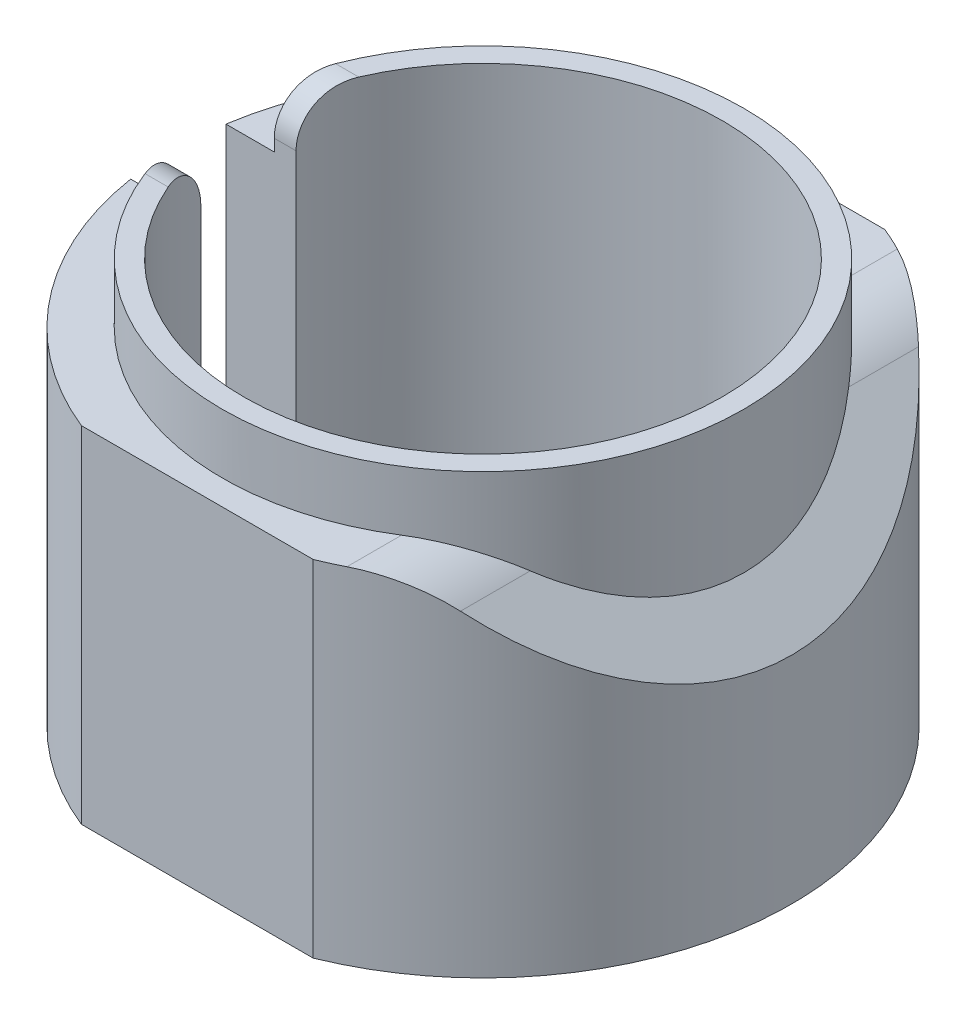
ISO-10303-21;
HEADER;
FILE_DESCRIPTION(('STEP AP214'),'2;1');
FILE_NAME('part.step','',(''),(''),'','','');
FILE_SCHEMA(('AUTOMOTIVE_DESIGN { 1 0 10303 214 1 1 1 1 }'));
ENDSEC;
DATA;
#1=APPLICATION_CONTEXT('core data for automotive mechanical design processes');
#2=APPLICATION_PROTOCOL_DEFINITION('international standard','automotive_design',2000,#1);
#3=PRODUCT_CONTEXT('',#1,'mechanical');
#4=PRODUCT('Part','Part','',(#3));
#5=PRODUCT_RELATED_PRODUCT_CATEGORY('part','',(#4));
#6=PRODUCT_DEFINITION_FORMATION('','',#4);
#7=PRODUCT_DEFINITION_CONTEXT('part definition',#1,'design');
#8=PRODUCT_DEFINITION('design','',#6,#7);
#9=PRODUCT_DEFINITION_SHAPE('','',#8);
#10=(LENGTH_UNIT() NAMED_UNIT(*) SI_UNIT(.MILLI.,.METRE.));
#11=(NAMED_UNIT(*) PLANE_ANGLE_UNIT() SI_UNIT($,.RADIAN.));
#12=(NAMED_UNIT(*) SI_UNIT($,.STERADIAN.) SOLID_ANGLE_UNIT());
#13=UNCERTAINTY_MEASURE_WITH_UNIT(LENGTH_MEASURE(1.E-05),#10,'distance_accuracy_value','');
#14=(GEOMETRIC_REPRESENTATION_CONTEXT(3) GLOBAL_UNCERTAINTY_ASSIGNED_CONTEXT((#13)) GLOBAL_UNIT_ASSIGNED_CONTEXT((#10,
#11,#12)) REPRESENTATION_CONTEXT('',''));
#15=CARTESIAN_POINT('',(0.,0.,0.));
#16=DIRECTION('',(0.,0.,1.));
#17=DIRECTION('',(1.,0.,0.));
#18=AXIS2_PLACEMENT_3D('',#15,#16,#17);
#19=CARTESIAN_POINT('',(0.,12.5,0.));
#20=DIRECTION('',(0.,1.,0.));
#21=DIRECTION('',(0.,0.,1.));
#22=AXIS2_PLACEMENT_3D('',#19,#20,#21);
#23=PLANE('',#22);
#24=CARTESIAN_POINT('',(0.,12.5,0.));
#25=DIRECTION('',(0.,1.,0.));
#26=DIRECTION('',(0.,0.,1.));
#27=AXIS2_PLACEMENT_3D('',#24,#25,#26);
#28=CIRCLE('',#27,10.95);
#29=CARTESIAN_POINT('',(-10.7658023388877,12.5,-2.));
#30=VERTEX_POINT('',#29);
#31=CARTESIAN_POINT('',(5.84314575050762,12.5,-9.26067749888337));
#32=VERTEX_POINT('',#31);
#33=EDGE_CURVE('E237',#30,#32,#28,.F.);
#34=ORIENTED_EDGE('',*,*,#33,.T.);
#35=DIRECTION('',(0.,0.,1.));
#36=VECTOR('',#35,1.);
#37=CARTESIAN_POINT('',(5.84314575050762,12.5,-10.5571066111885));
#38=LINE('',#37,#36);
#39=CARTESIAN_POINT('',(5.84314575050762,12.5,-11.5568225623795));
#40=VERTEX_POINT('',#39);
#41=EDGE_CURVE('E365',#32,#40,#38,.F.);
#42=ORIENTED_EDGE('',*,*,#41,.T.);
#43=CARTESIAN_POINT('',(0.,12.5,0.));
#44=DIRECTION('',(0.,1.,0.));
#45=DIRECTION('',(0.,0.,1.));
#46=AXIS2_PLACEMENT_3D('',#43,#44,#45);
#47=CIRCLE('',#46,12.95);
#48=CARTESIAN_POINT('',(4.86852133609374,12.5,-12.));
#49=VERTEX_POINT('',#48);
#50=EDGE_CURVE('E439',#40,#49,#47,.T.);
#51=ORIENTED_EDGE('',*,*,#50,.T.);
#52=DIRECTION('',(1.,0.,0.));
#53=VECTOR('',#52,1.);
#54=CARTESIAN_POINT('',(0.,12.5,-12.));
#55=LINE('',#54,#53);
#56=CARTESIAN_POINT('',(-4.86852133609374,12.5,-12.));
#57=VERTEX_POINT('',#56);
#58=EDGE_CURVE('E415',#57,#49,#55,.T.);
#59=ORIENTED_EDGE('',*,*,#58,.F.);
#60=CARTESIAN_POINT('',(-12.7946277788766,12.5,-2.));
#61=VERTEX_POINT('',#60);
#62=EDGE_CURVE('E241',#57,#61,#47,.T.);
#63=ORIENTED_EDGE('',*,*,#62,.T.);
#64=DIRECTION('',(1.,0.,0.));
#65=VECTOR('',#64,1.);
#66=CARTESIAN_POINT('',(0.,12.5,-2.));
#67=LINE('',#66,#65);
#68=EDGE_CURVE('E230',#61,#30,#67,.T.);
#69=ORIENTED_EDGE('',*,*,#68,.T.);
#70=EDGE_LOOP('',(#34,#42,#51,#59,#63,#69));
#71=FACE_BOUND('',#70,.T.);
#72=ADVANCED_FACE('F103',(#71),#23,.T.);
#73=CARTESIAN_POINT('',(10.,10.,-12.));
#74=DIRECTION('',(-0.707106781186547,-0.707106781186547,0.));
#75=DIRECTION('',(0.707106781186548,-0.707106781186548,0.));
#76=AXIS2_PLACEMENT_3D('',#73,#74,#75);
#77=PLANE('',#76);
#78=CARTESIAN_POINT('',(0.,20.,0.));
#79=DIRECTION('',(-0.707106781186547,-0.707106781186547,0.));
#80=DIRECTION('',(0.707106781186548,-0.707106781186548,0.));
#81=AXIS2_PLACEMENT_3D('',#78,#79,#80);
#82=ELLIPSE('',#81,15.4856385079854,10.95);
#83=CARTESIAN_POINT('',(8.67157287525381,11.3284271247462,6.68627877590834));
#84=VERTEX_POINT('',#83);
#85=CARTESIAN_POINT('',(8.67157287525381,11.3284271247462,-6.68627877590834));
#86=VERTEX_POINT('',#85);
#87=EDGE_CURVE('E258',#84,#86,#82,.F.);
#88=ORIENTED_EDGE('',*,*,#87,.F.);
#89=DIRECTION('',(0.,0.,1.));
#90=VECTOR('',#89,1.);
#91=CARTESIAN_POINT('',(8.67157287525381,11.3284271247462,10.5571066111885));
#92=LINE('',#91,#90);
#93=CARTESIAN_POINT('',(8.67157287525381,11.3284271247462,9.61802078751977));
#94=VERTEX_POINT('',#93);
#95=EDGE_CURVE('E373',#84,#94,#92,.T.);
#96=ORIENTED_EDGE('',*,*,#95,.T.);
#97=CARTESIAN_POINT('',(0.,20.,0.));
#98=DIRECTION('',(-0.707106781186547,-0.707106781186547,0.));
#99=DIRECTION('',(-0.707106781186548,0.707106781186548,0.));
#100=AXIS2_PLACEMENT_3D('',#97,#98,#99);
#101=ELLIPSE('',#100,18.3140656327316,12.95);
#102=CARTESIAN_POINT('',(8.67157287525381,11.3284271247462,-9.61802078751977));
#103=VERTEX_POINT('',#102);
#104=EDGE_CURVE('E413',#94,#103,#101,.F.);
#105=ORIENTED_EDGE('',*,*,#104,.T.);
#106=DIRECTION('',(0.,0.,1.));
#107=VECTOR('',#106,1.);
#108=CARTESIAN_POINT('',(8.67157287525381,11.3284271247462,-7.97825168818332));
#109=LINE('',#108,#107);
#110=EDGE_CURVE('E378',#103,#86,#109,.T.);
#111=ORIENTED_EDGE('',*,*,#110,.T.);
#112=EDGE_LOOP('',(#88,#96,#105,#111));
#113=FACE_BOUND('',#112,.T.);
#114=ADVANCED_FACE('F465',(#113),#77,.F.);
#115=CARTESIAN_POINT('',(0.,-38.6281312654632,0.));
#116=DIRECTION('',(0.,1.,0.));
#117=DIRECTION('',(0.,0.,1.));
#118=AXIS2_PLACEMENT_3D('',#115,#116,#117);
#119=CYLINDRICAL_SURFACE('',#118,12.95);
#120=ORIENTED_EDGE('',*,*,#104,.F.);
#121=CARTESIAN_POINT('',(8.67157287525381,11.3284271247462,9.61802078751977));
#122=CARTESIAN_POINT('',(8.56843339638165,11.4315009301273,9.71104621796136));
#123=CARTESIAN_POINT('',(8.46036247208684,11.5283598370203,9.80544111251875));
#124=CARTESIAN_POINT('',(8.23497626491933,11.709383813392,9.99545948181946));
#125=CARTESIAN_POINT('',(8.11765825378154,11.7935451150587,10.0910833121313));
#126=CARTESIAN_POINT('',(7.87819876781828,11.9464598240635,10.2790560358235));
#127=CARTESIAN_POINT('',(7.75631667483663,12.0156075538522,10.3714151873124));
#128=CARTESIAN_POINT('',(7.50508383645346,12.1411092613291,10.5546368639504));
#129=CARTESIAN_POINT('',(7.37573465969701,12.1974659139188,10.6454996983201));
#130=CARTESIAN_POINT('',(7.13547625121042,12.2872222381665,10.8076044530726));
#131=CARTESIAN_POINT('',(7.02573331149218,12.3229492799191,10.879294016151));
#132=CARTESIAN_POINT('',(6.80225289194555,12.3850429232303,11.0204045561486));
#133=CARTESIAN_POINT('',(6.68851677182059,12.4114126776781,11.0898262900289));
#134=CARTESIAN_POINT('',(6.45461146814002,12.454821196604,11.227615088737));
#135=CARTESIAN_POINT('',(6.33435223977707,12.4716055644857,11.2959104150233));
#136=CARTESIAN_POINT('',(6.09080459229661,12.4942012407027,11.4290863500517));
#137=CARTESIAN_POINT('',(5.96751338233876,12.5000020244108,11.4939636257717));
#138=CARTESIAN_POINT('',(5.84314575050762,12.5,11.5568225623795));
#139=B_SPLINE_CURVE_WITH_KNOTS('',3,(#121,#122,#123,#124,#125,#126,#127,#128,#129,#130,#131,
#132,#133,#134,#135,#136,#137,#138),.UNSPECIFIED.,.F.,.F.,(4,2,2,2,2,2,2,2,4),(0.,
0.518663181519247,1.03747996664538,1.54033758438005,2.04308994619965,2.45031319997644,
2.85739911141748,3.27483937652447,3.69267943682645),.UNSPECIFIED.);
#140=CARTESIAN_POINT('',(5.84314575050762,12.5,11.5568225623795));
#141=VERTEX_POINT('',#140);
#142=EDGE_CURVE('E354',#94,#141,#139,.T.);
#143=ORIENTED_EDGE('',*,*,#142,.T.);
#144=CARTESIAN_POINT('',(4.86852133609374,12.5,12.));
#145=VERTEX_POINT('',#144);
#146=EDGE_CURVE('E437',#145,#141,#47,.T.);
#147=ORIENTED_EDGE('',*,*,#146,.F.);
#148=DIRECTION('',(0.,1.,0.));
#149=VECTOR('',#148,1.);
#150=CARTESIAN_POINT('',(4.86852133609374,-38.6281312654632,12.));
#151=LINE('',#150,#149);
#152=CARTESIAN_POINT('',(4.86852133609374,-2.,12.));
#153=VERTEX_POINT('',#152);
#154=EDGE_CURVE('E428',#145,#153,#151,.F.);
#155=ORIENTED_EDGE('',*,*,#154,.T.);
#156=CARTESIAN_POINT('',(0.,-2.,0.));
#157=DIRECTION('',(0.,1.,0.));
#158=DIRECTION('',(0.,0.,1.));
#159=AXIS2_PLACEMENT_3D('',#156,#157,#158);
#160=CIRCLE('',#159,12.95);
#161=CARTESIAN_POINT('',(4.86852133609374,-2.,-12.));
#162=VERTEX_POINT('',#161);
#163=EDGE_CURVE('E436',#162,#153,#160,.F.);
#164=ORIENTED_EDGE('',*,*,#163,.F.);
#165=DIRECTION('',(0.,1.,0.));
#166=VECTOR('',#165,1.);
#167=CARTESIAN_POINT('',(4.86852133609374,-38.6281312654632,-12.));
#168=LINE('',#167,#166);
#169=EDGE_CURVE('E420',#49,#162,#168,.F.);
#170=ORIENTED_EDGE('',*,*,#169,.F.);
#171=ORIENTED_EDGE('',*,*,#50,.F.);
#172=CARTESIAN_POINT('',(5.84314575050762,12.5,-11.5568225623795));
#173=CARTESIAN_POINT('',(5.99863575084707,12.5000010670294,-11.47825704177));
#174=CARTESIAN_POINT('',(6.15239574329887,12.4909379210163,-11.3965283253239));
#175=CARTESIAN_POINT('',(6.45486830548763,12.4558733660924,-11.2279472274124));
#176=CARTESIAN_POINT('',(6.60358690150429,12.4298929887283,-11.1411013294063));
#177=CARTESIAN_POINT('',(6.89039388825273,12.3631987474695,-10.9659677345504));
#178=CARTESIAN_POINT('',(7.02866757302276,12.3229525376403,-10.877802380175));
#179=CARTESIAN_POINT('',(7.29850174753831,12.2285879906429,-10.6986250176063));
#180=CARTESIAN_POINT('',(7.43006115452062,12.1744674244799,-10.6076125540733));
#181=CARTESIAN_POINT('',(7.66001955707812,12.0653547465125,-10.4423388602464));
#182=CARTESIAN_POINT('',(7.7597711160899,12.0127215258195,-10.3683851600376));
#183=CARTESIAN_POINT('',(7.95418482487935,11.899435819257,-10.2199996403586));
#184=CARTESIAN_POINT('',(8.04884850996478,11.8387857718592,-10.1455679727951));
#185=CARTESIAN_POINT('',(8.23512712945479,11.7080691333295,-9.99499172872379));
#186=CARTESIAN_POINT('',(8.32660653623354,11.6378049167526,-9.91885088648539));
#187=CARTESIAN_POINT('',(8.50363378111221,11.4891674644433,-9.76751523179292));
#188=CARTESIAN_POINT('',(8.58917963222626,11.4107915340068,-9.69232074308097));
#189=CARTESIAN_POINT('',(8.67157287525381,11.3284271247462,-9.61802078751977));
#190=B_SPLINE_CURVE_WITH_KNOTS('',3,(#172,#173,#174,#175,#176,#177,#178,#179,#180,#181,#182,
#183,#184,#185,#186,#187,#188,#189),.UNSPECIFIED.,.F.,.F.,(4,2,2,2,2,2,2,2,4),(0.,
0.522196554669505,1.04374514948574,1.54957472730347,2.05548562052175,2.4597713700069,
2.8639344299895,3.27820904646954,3.69262172904286),.UNSPECIFIED.);
#191=EDGE_CURVE('E369',#40,#103,#190,.T.);
#192=ORIENTED_EDGE('',*,*,#191,.T.);
#193=EDGE_LOOP('',(#120,#143,#147,#155,#164,#170,#171,#192));
#194=FACE_BOUND('',#193,.T.);
#195=ADVANCED_FACE('F314',(#194),#119,.T.);
#196=DIRECTION('',(0.,1.,0.));
#197=VECTOR('',#196,1.);
#198=CARTESIAN_POINT('',(-12.7946277788766,-38.6281312654632,2.));
#199=LINE('',#198,#197);
#200=CARTESIAN_POINT('',(-12.7946277788766,1.99999999999999,2.));
#201=VERTEX_POINT('',#200);
#202=CARTESIAN_POINT('',(-12.7946277788766,12.5,2.));
#203=VERTEX_POINT('',#202);
#204=EDGE_CURVE('E411',#201,#203,#199,.T.);
#205=ORIENTED_EDGE('',*,*,#204,.F.);
#206=CARTESIAN_POINT('',(-12.7946277788766,2.,2.));
#207=CARTESIAN_POINT('',(-12.7946256332506,1.94408781043635,2.00000002573826));
#208=CARTESIAN_POINT('',(-12.7949947479576,1.88820273819576,1.99765388963396));
#209=CARTESIAN_POINT('',(-12.7964529824156,1.77683916091667,1.98829682131698));
#210=CARTESIAN_POINT('',(-12.7975420354279,1.72136061867447,1.98128632149406));
#211=CARTESIAN_POINT('',(-12.8018492907163,1.55628329415424,1.95333880678219));
#212=CARTESIAN_POINT('',(-12.8061077787187,1.44780072599633,1.92548550077359));
#213=CARTESIAN_POINT('',(-12.8169175381375,1.23712269491746,1.85215577418208));
#214=CARTESIAN_POINT('',(-12.8234694310701,1.13492894511174,1.80667457605526));
#215=CARTESIAN_POINT('',(-12.8381248342533,0.939604815726317,1.69940297039855));
#216=CARTESIAN_POINT('',(-12.8462283567749,0.846474507833138,1.63761243388568));
#217=CARTESIAN_POINT('',(-12.8631491660451,0.67116909493783,1.49893143639688));
#218=CARTESIAN_POINT('',(-12.8719713191882,0.589080746372092,1.42193194358738));
#219=CARTESIAN_POINT('',(-12.8892934354307,0.438922995521076,1.25523787570596));
#220=CARTESIAN_POINT('',(-12.8977933369221,0.37085626297225,1.16554088848749));
#221=CARTESIAN_POINT('',(-12.9135655225394,0.250350104548857,0.975429449628955));
#222=CARTESIAN_POINT('',(-12.9208310146627,0.197995996840185,0.874960367828575));
#223=CARTESIAN_POINT('',(-12.9332549284202,0.110966222855453,0.66654543071696));
#224=CARTESIAN_POINT('',(-12.9384147257827,0.0762790104560919,0.558604511132324));
#225=CARTESIAN_POINT('',(-12.9447779408629,0.0340254317766948,0.3750257805887));
#226=CARTESIAN_POINT('',(-12.9467261965863,0.0212778955814985,0.300564992169304));
#227=CARTESIAN_POINT('',(-12.9493413997215,0.00426401957549366,0.150747445660465));
#228=CARTESIAN_POINT('',(-12.9500098440486,-1.22287739627625E-05,0.0753918381634179));
#229=CARTESIAN_POINT('',(-12.95,0.,0.));
#230=B_SPLINE_CURVE_WITH_KNOTS('',3,(#206,#207,#208,#209,#210,#211,#212,#213,#214,#215,#216,
#217,#218,#219,#220,#221,#222,#223,#224,#225,#226,#227,#228,#229),.UNSPECIFIED.,.F.,.F.,(4,2,2,
2,2,2,2,2,2,2,2,4),(0.,0.167632475682958,0.335249413883563,0.669766357677263,1.00437402633827,
1.33898434133517,1.67608672267633,2.01325322960552,2.35221870858211,2.69096237295107,
2.91720895132186,3.14319074117967),.UNSPECIFIED.);
#231=CARTESIAN_POINT('',(-12.95,0.,0.));
#232=VERTEX_POINT('',#231);
#233=EDGE_CURVE('E330',#201,#232,#230,.T.);
#234=ORIENTED_EDGE('',*,*,#233,.T.);
#235=CARTESIAN_POINT('',(-12.95,0.,0.));
#236=CARTESIAN_POINT('',(-12.950002014148,-1.48172826040973E-08,-0.0559162229000142));
#237=CARTESIAN_POINT('',(-12.9496373883563,0.00234644960810248,-0.111805341523206));
#238=CARTESIAN_POINT('',(-12.9481962405879,0.0117048966110776,-0.223177238487953));
#239=CARTESIAN_POINT('',(-12.9471197832777,0.0187164553872646,-0.278660053277413));
#240=CARTESIAN_POINT('',(-12.942860681548,0.0466685575209165,-0.443751704701726));
#241=CARTESIAN_POINT('',(-12.9386481279771,0.0745268002895366,-0.55224462048176));
#242=CARTESIAN_POINT('',(-12.9279380237389,0.147870899920631,-0.762943912039565));
#243=CARTESIAN_POINT('',(-12.9214398346178,0.193361682499116,-0.865148521902832));
#244=CARTESIAN_POINT('',(-12.9068762993701,0.30065568075933,-1.06049052813423));
#245=CARTESIAN_POINT('',(-12.8988109492736,0.362458937763856,-1.15362790153239));
#246=CARTESIAN_POINT('',(-12.8819363508063,0.501152788024086,-1.32892507689081));
#247=CARTESIAN_POINT('',(-12.8731221313219,0.578149556362757,-1.41100036080273));
#248=CARTESIAN_POINT('',(-12.8557803600952,0.744832811767628,-1.56113298045433));
#249=CARTESIAN_POINT('',(-12.8472528645212,0.83452176747307,-1.62918758282288));
#250=CARTESIAN_POINT('',(-12.8314006752412,1.02462611917452,-1.7496809627547));
#251=CARTESIAN_POINT('',(-12.824082821451,1.12509754611792,-1.80203221684575));
#252=CARTESIAN_POINT('',(-12.8115538637689,1.33351726637838,-1.88905593253119));
#253=CARTESIAN_POINT('',(-12.8063413737306,1.44146058526554,-1.92374002991201));
#254=CARTESIAN_POINT('',(-12.7999100470753,1.62503072282316,-1.96598485794204));
#255=CARTESIAN_POINT('',(-12.7979397392583,1.69947979903887,-1.97872844716275));
#256=CARTESIAN_POINT('',(-12.7952941861159,1.84927457081914,-1.99573722333451));
#257=CARTESIAN_POINT('',(-12.7946174381016,1.92461912358411,-2.0000122481689));
#258=CARTESIAN_POINT('',(-12.7946277788766,2.,-2.));
#259=B_SPLINE_CURVE_WITH_KNOTS('',3,(#235,#236,#237,#238,#239,#240,#241,#242,#243,#244,#245,
#246,#247,#248,#249,#250,#251,#252,#253,#254,#255,#256,#257,#258),.UNSPECIFIED.,.F.,.F.,(4,2,2,
2,2,2,2,2,2,2,2,4),(0.,0.167644611880985,0.335273996133688,0.669819430009937,1.00445838783946,
1.33909819338527,1.67616509087818,2.01329763845469,2.35227571580647,2.69103024881158,
2.91724192675227,3.14319066139638),.UNSPECIFIED.);
#260=CARTESIAN_POINT('',(-12.7946277788766,1.99999999999999,-2.));
#261=VERTEX_POINT('',#260);
#262=EDGE_CURVE('E331',#232,#261,#259,.T.);
#263=ORIENTED_EDGE('',*,*,#262,.T.);
#264=DIRECTION('',(0.,1.,0.));
#265=VECTOR('',#264,1.);
#266=CARTESIAN_POINT('',(-12.7946277788766,-38.6281312654632,-2.));
#267=LINE('',#266,#265);
#268=EDGE_CURVE('E242',#261,#61,#267,.T.);
#269=ORIENTED_EDGE('',*,*,#268,.T.);
#270=ORIENTED_EDGE('',*,*,#62,.F.);
#271=DIRECTION('',(0.,1.,0.));
#272=VECTOR('',#271,1.);
#273=CARTESIAN_POINT('',(-4.86852133609374,-38.6281312654632,-12.));
#274=LINE('',#273,#272);
#275=CARTESIAN_POINT('',(-4.86852133609374,-2.,-12.));
#276=VERTEX_POINT('',#275);
#277=EDGE_CURVE('E418',#276,#57,#274,.T.);
#278=ORIENTED_EDGE('',*,*,#277,.F.);
#279=CARTESIAN_POINT('',(-4.86852133609374,-2.,12.));
#280=VERTEX_POINT('',#279);
#281=EDGE_CURVE('E432',#280,#276,#160,.F.);
#282=ORIENTED_EDGE('',*,*,#281,.F.);
#283=DIRECTION('',(0.,1.,0.));
#284=VECTOR('',#283,1.);
#285=CARTESIAN_POINT('',(-4.86852133609374,-38.6281312654632,12.));
#286=LINE('',#285,#284);
#287=CARTESIAN_POINT('',(-4.86852133609374,12.5,12.));
#288=VERTEX_POINT('',#287);
#289=EDGE_CURVE('E425',#280,#288,#286,.T.);
#290=ORIENTED_EDGE('',*,*,#289,.T.);
#291=EDGE_CURVE('E431',#203,#288,#47,.T.);
#292=ORIENTED_EDGE('',*,*,#291,.F.);
#293=EDGE_LOOP('',(#205,#234,#263,#269,#270,#278,#282,#290,#292));
#294=FACE_BOUND('',#293,.T.);
#295=ADVANCED_FACE('F468',(#294),#119,.T.);
#296=ORIENTED_EDGE('',*,*,#146,.T.);
#297=DIRECTION('',(0.,0.,1.));
#298=VECTOR('',#297,1.);
#299=CARTESIAN_POINT('',(5.84314575050762,12.5,7.97825168818332));
#300=LINE('',#299,#298);
#301=CARTESIAN_POINT('',(5.84314575050762,12.5,9.26067749888337));
#302=VERTEX_POINT('',#301);
#303=EDGE_CURVE('E126',#141,#302,#300,.F.);
#304=ORIENTED_EDGE('',*,*,#303,.T.);
#305=CARTESIAN_POINT('',(-10.7658023388877,12.5,2.));
#306=VERTEX_POINT('',#305);
#307=EDGE_CURVE('E246',#302,#306,#28,.F.);
#308=ORIENTED_EDGE('',*,*,#307,.T.);
#309=DIRECTION('',(1.,0.,0.));
#310=VECTOR('',#309,1.);
#311=CARTESIAN_POINT('',(0.,12.5,2.));
#312=LINE('',#311,#310);
#313=EDGE_CURVE('E408',#203,#306,#312,.T.);
#314=ORIENTED_EDGE('',*,*,#313,.F.);
#315=ORIENTED_EDGE('',*,*,#291,.T.);
#316=DIRECTION('',(1.,0.,0.));
#317=VECTOR('',#316,1.);
#318=CARTESIAN_POINT('',(0.,12.5,12.));
#319=LINE('',#318,#317);
#320=EDGE_CURVE('E422',#288,#145,#319,.T.);
#321=ORIENTED_EDGE('',*,*,#320,.T.);
#322=EDGE_LOOP('',(#296,#304,#308,#314,#315,#321));
#323=FACE_BOUND('',#322,.T.);
#324=ADVANCED_FACE('F473',(#323),#23,.T.);
#325=CARTESIAN_POINT('',(0.,-2.,0.));
#326=DIRECTION('',(0.,1.,0.));
#327=DIRECTION('',(0.,0.,1.));
#328=AXIS2_PLACEMENT_3D('',#325,#326,#327);
#329=PLANE('',#328);
#330=CARTESIAN_POINT('',(0.,-2.,0.));
#331=DIRECTION('',(0.,1.,0.));
#332=DIRECTION('',(0.,0.,1.));
#333=AXIS2_PLACEMENT_3D('',#330,#331,#332);
#334=CIRCLE('',#333,1.6);
#335=CARTESIAN_POINT('',(0.,-2.,1.6));
#336=VERTEX_POINT('',#335);
#337=EDGE_CURVE('E393',#336,#336,#334,.T.);
#338=ORIENTED_EDGE('',*,*,#337,.T.);
#339=EDGE_LOOP('',(#338));
#340=FACE_BOUND('',#339,.T.);
#341=DIRECTION('',(1.,0.,0.));
#342=VECTOR('',#341,1.);
#343=CARTESIAN_POINT('',(0.,-2.,12.));
#344=LINE('',#343,#342);
#345=EDGE_CURVE('E256',#280,#153,#344,.T.);
#346=ORIENTED_EDGE('',*,*,#345,.F.);
#347=ORIENTED_EDGE('',*,*,#281,.T.);
#348=DIRECTION('',(1.,0.,0.));
#349=VECTOR('',#348,1.);
#350=CARTESIAN_POINT('',(0.,-2.,-12.));
#351=LINE('',#350,#349);
#352=EDGE_CURVE('E249',#276,#162,#351,.T.);
#353=ORIENTED_EDGE('',*,*,#352,.T.);
#354=ORIENTED_EDGE('',*,*,#163,.T.);
#355=EDGE_LOOP('',(#346,#347,#353,#354));
#356=FACE_BOUND('',#355,.T.);
#357=ADVANCED_FACE('F481',(#340,#356),#329,.F.);
#358=CARTESIAN_POINT('',(0.,-2.,0.));
#359=DIRECTION('',(0.,1.,0.));
#360=DIRECTION('',(0.,0.,1.));
#361=AXIS2_PLACEMENT_3D('',#358,#359,#360);
#362=CYLINDRICAL_SURFACE('',#361,10.95);
#363=CARTESIAN_POINT('',(0.,15.,0.));
#364=DIRECTION('',(0.,1.,0.));
#365=DIRECTION('',(0.,0.,1.));
#366=AXIS2_PLACEMENT_3D('',#363,#364,#365);
#367=CIRCLE('',#366,10.95);
#368=CARTESIAN_POINT('',(-10.1932575754761,15.,4.));
#369=VERTEX_POINT('',#368);
#370=CARTESIAN_POINT('',(-10.1932575754761,15.,-4.));
#371=VERTEX_POINT('',#370);
#372=EDGE_CURVE('E250',#369,#371,#367,.T.);
#373=ORIENTED_EDGE('',*,*,#372,.F.);
#374=CARTESIAN_POINT('',(-10.1932575754761,15.,4.));
#375=CARTESIAN_POINT('',(-10.215252763081,14.9999980404342,3.94395580736491));
#376=CARTESIAN_POINT('',(-10.2367726894939,14.9976424240735,3.88774865686013));
#377=CARTESIAN_POINT('',(-10.278763936511,14.9881427232847,3.77532885443158));
#378=CARTESIAN_POINT('',(-10.2992349308407,14.9809971585409,3.7191162061801));
#379=CARTESIAN_POINT('',(-10.3589318186561,14.9522440665045,3.55093412099844));
#380=CARTESIAN_POINT('',(-10.396414218504,14.9233199415595,3.43949052860539));
#381=CARTESIAN_POINT('',(-10.4660062849451,14.8459210445999,3.22154624898223));
#382=CARTESIAN_POINT('',(-10.4981034747342,14.7974017349488,3.11505744249417));
#383=CARTESIAN_POINT('',(-10.5564731190204,14.6816816580941,2.91111916175955));
#384=CARTESIAN_POINT('',(-10.5827523464388,14.6145028208865,2.81365925433323));
#385=CARTESIAN_POINT('',(-10.6284541461997,14.4667138672042,2.6356283805551));
#386=CARTESIAN_POINT('',(-10.648139927659,14.386878914054,2.55448069235084));
#387=CARTESIAN_POINT('',(-10.6825646937403,14.2139256856405,2.40647086598696));
#388=CARTESIAN_POINT('',(-10.6973022679429,14.1208036338297,2.33961280286125));
#389=CARTESIAN_POINT('',(-10.721848488476,13.9270807844682,2.22437484910673));
#390=CARTESIAN_POINT('',(-10.7317936886813,13.8267944908461,2.17549381476017));
#391=CARTESIAN_POINT('',(-10.7477910021851,13.6192576023916,2.09503794195539));
#392=CARTESIAN_POINT('',(-10.7538463120501,13.5120128058043,2.06344889675159));
#393=CARTESIAN_POINT('',(-10.7606900674744,13.3366406188279,2.02737163758506));
#394=CARTESIAN_POINT('',(-10.7626129789312,13.269688414526,2.01711247846942));
#395=CARTESIAN_POINT('',(-10.7651655394167,13.1351674568692,2.00342879892052));
#396=CARTESIAN_POINT('',(-10.7657971441038,13.0675997917526,1.99999394343758));
#397=CARTESIAN_POINT('',(-10.7658023388877,13.,2.));
#398=B_SPLINE_CURVE_WITH_KNOTS('',3,(#374,#375,#376,#377,#378,#379,#380,#381,#382,#383,#384,
#385,#386,#387,#388,#389,#390,#391,#392,#393,#394,#395,#396,#397),.UNSPECIFIED.,.F.,.F.,(4,2,2,
2,2,2,2,2,2,2,2,4),(0.,0.180521425972547,0.36109866715912,0.722475887843784,1.08467914258227,
1.44645849863325,1.79131682507501,2.1362733654185,2.47071461982338,2.80488069013857,
3.00783442325068,3.21048055858087),.UNSPECIFIED.);
#399=CARTESIAN_POINT('',(-10.7658023388877,13.,2.));
#400=VERTEX_POINT('',#399);
#401=EDGE_CURVE('E272',#369,#400,#398,.T.);
#402=ORIENTED_EDGE('',*,*,#401,.T.);
#403=DIRECTION('',(0.,1.,0.));
#404=VECTOR('',#403,1.);
#405=CARTESIAN_POINT('',(-10.7658023388877,-2.,2.));
#406=LINE('',#405,#404);
#407=EDGE_CURVE('E405',#306,#400,#406,.T.);
#408=ORIENTED_EDGE('',*,*,#407,.F.);
#409=ORIENTED_EDGE('',*,*,#307,.F.);
#410=CARTESIAN_POINT('',(5.84314575050762,12.5,9.26067749888337));
#411=CARTESIAN_POINT('',(5.98938209950837,12.4999909726688,9.16845309178599));
#412=CARTESIAN_POINT('',(6.13328044290744,12.4919849200221,9.07277384412176));
#413=CARTESIAN_POINT('',(6.41516748853902,12.4614222940156,8.87566495463887));
#414=CARTESIAN_POINT('',(6.5531651961525,12.4388888036242,8.774244667679));
#415=CARTESIAN_POINT('',(6.8192394356403,12.3814074311287,8.56901936839899));
#416=CARTESIAN_POINT('',(6.94747497878486,12.3467720772026,8.46533087056427));
#417=CARTESIAN_POINT('',(7.1971144624535,12.266162392884,8.25413651125202));
#418=CARTESIAN_POINT('',(7.31851581736812,12.2201838058966,8.14662922975389));
#419=CARTESIAN_POINT('',(7.55268022035448,12.1185071762072,7.92998521218733));
#420=CARTESIAN_POINT('',(7.66552918262403,12.0629318899487,7.82088331713557));
#421=CARTESIAN_POINT('',(7.88398131612507,11.9424616735392,7.60061866077882));
#422=CARTESIAN_POINT('',(7.98958470726526,11.8775670264231,7.489455962151));
#423=CARTESIAN_POINT('',(8.19597544581695,11.7373095697184,7.26309145569034));
#424=CARTESIAN_POINT('',(8.29657828936818,11.6617269791222,7.14785786443215));
#425=CARTESIAN_POINT('',(8.48995579380428,11.5016751385003,6.91707275821386));
#426=CARTESIAN_POINT('',(8.58273297646401,11.4172087710876,6.80152135815578));
#427=CARTESIAN_POINT('',(8.67157287525381,11.3284271247462,6.68627877590834));
#428=B_SPLINE_CURVE_WITH_KNOTS('',3,(#410,#411,#412,#413,#414,#415,#416,#417,#418,#419,#420,
#421,#422,#423,#424,#425,#426,#427),.UNSPECIFIED.,.F.,.F.,(4,2,2,2,2,2,2,2,4),(0.,
0.518238494883705,1.03565557180049,1.54059317571899,2.04572054853116,2.54480963729818,
3.04388357161824,3.55534028042088,4.06663154048371),.UNSPECIFIED.);
#429=EDGE_CURVE('E113',#302,#84,#428,.T.);
#430=ORIENTED_EDGE('',*,*,#429,.T.);
#431=ORIENTED_EDGE('',*,*,#87,.T.);
#432=CARTESIAN_POINT('',(8.67157287525381,11.3284271247462,-6.68627877590834));
#433=CARTESIAN_POINT('',(8.5825110430061,11.4174301747021,-6.80180942463357));
#434=CARTESIAN_POINT('',(8.48949220478012,11.5020968790158,-6.91765023772995));
#435=CARTESIAN_POINT('',(8.29559154718877,11.6625051068781,-7.1490111779203));
#436=CARTESIAN_POINT('',(8.19470711412123,11.7382436424543,-7.26453118509245));
#437=CARTESIAN_POINT('',(7.98772927810993,11.8787565857703,-7.49144270113695));
#438=CARTESIAN_POINT('',(7.8818218065354,11.9437525419928,-7.60286635107109));
#439=CARTESIAN_POINT('',(7.66272768703201,12.0643745449507,-7.82363620290138));
#440=CARTESIAN_POINT('',(7.5495408652091,12.1200003677311,-7.93298235508796));
#441=CARTESIAN_POINT('',(7.31523589385804,12.2214730698144,-8.14956760186886));
#442=CARTESIAN_POINT('',(7.19406645220567,12.2672465661143,-8.25678582548219));
#443=CARTESIAN_POINT('',(6.94492709359735,12.3474926078862,-8.46741405088636));
#444=CARTESIAN_POINT('',(6.81695974938452,12.3819693938113,-8.57082546867164));
#445=CARTESIAN_POINT('',(6.55146987109813,12.4391828196101,-8.77550274344092));
#446=CARTESIAN_POINT('',(6.41378950899306,12.461608915353,-8.87665276907741));
#447=CARTESIAN_POINT('',(6.13256922186978,12.4920244922726,-9.07324648932016));
#448=CARTESIAN_POINT('',(5.98902038111741,12.4999911040569,-9.16868091393496));
#449=CARTESIAN_POINT('',(5.84314575050762,12.5,-9.26067749888337));
#450=B_SPLINE_CURVE_WITH_KNOTS('',3,(#432,#433,#434,#435,#436,#437,#438,#439,#440,#441,#442,
#443,#444,#445,#446,#447,#448,#449),.UNSPECIFIED.,.F.,.F.,(4,2,2,2,2,2,2,2,4),(0.,
0.512568110084649,1.02530727620814,1.52559792920516,2.02590053792708,2.52980962688948,
3.03352934591852,3.54967327637729,4.06663284079862),.UNSPECIFIED.);
#451=EDGE_CURVE('E12',#86,#32,#450,.T.);
#452=ORIENTED_EDGE('',*,*,#451,.T.);
#453=ORIENTED_EDGE('',*,*,#33,.F.);
#454=DIRECTION('',(0.,1.,0.));
#455=VECTOR('',#454,1.);
#456=CARTESIAN_POINT('',(-10.7658023388877,-2.,-2.));
#457=LINE('',#456,#455);
#458=CARTESIAN_POINT('',(-10.7658023388877,13.,-2.));
#459=VERTEX_POINT('',#458);
#460=EDGE_CURVE('E225',#30,#459,#457,.T.);
#461=ORIENTED_EDGE('',*,*,#460,.T.);
#462=CARTESIAN_POINT('',(-10.7658023388877,13.,-2.));
#463=CARTESIAN_POINT('',(-10.7657998873099,13.0553582028588,-1.99999993684639));
#464=CARTESIAN_POINT('',(-10.7653753538818,13.1106898730469,-2.00229990746368));
#465=CARTESIAN_POINT('',(-10.7636662232265,13.2209566549138,-2.01147247984258));
#466=CARTESIAN_POINT('',(-10.7623816690621,13.2758917863087,-2.01834485265639));
#467=CARTESIAN_POINT('',(-10.757220221801,13.4394004844256,-2.04574708555658));
#468=CARTESIAN_POINT('',(-10.7520356433773,13.5468776363525,-2.0730622841861));
#469=CARTESIAN_POINT('',(-10.7379249867092,13.7556341988424,-2.14494578853034));
#470=CARTESIAN_POINT('',(-10.7289971088818,13.8569106015351,-2.18952239183904));
#471=CARTESIAN_POINT('',(-10.7070375952912,14.0504094007113,-2.29449546774585));
#472=CARTESIAN_POINT('',(-10.6940065910536,14.1426331876494,-2.3548895055899));
#473=CARTESIAN_POINT('',(-10.663441302374,14.3156132570701,-2.48963518133261));
#474=CARTESIAN_POINT('',(-10.6459003049603,14.3963521640152,-2.56400758077179));
#475=CARTESIAN_POINT('',(-10.6060347247716,14.5440971934401,-2.72421116398895));
#476=CARTESIAN_POINT('',(-10.583710153558,14.6111033491097,-2.81004232007207));
#477=CARTESIAN_POINT('',(-10.5338703812319,14.730565059369,-2.99149138482339));
#478=CARTESIAN_POINT('',(-10.5062953235317,14.7828336329972,-3.08721567446595));
#479=CARTESIAN_POINT('',(-10.4462675291435,14.8707994852415,-3.28460588133174));
#480=CARTESIAN_POINT('',(-10.4138128839891,14.9064902576427,-3.38627411375307));
#481=CARTESIAN_POINT('',(-10.3508352796189,14.9559582584554,-3.57359590414467));
#482=CARTESIAN_POINT('',(-10.3210475147448,14.972552033782,-3.65877150228198));
#483=CARTESIAN_POINT('',(-10.2589563222909,14.9945730418643,-3.82944868317047));
#484=CARTESIAN_POINT('',(-10.2266582993269,15.0000236106701,-3.91494920822444));
#485=CARTESIAN_POINT('',(-10.1932575754761,15.,-4.));
#486=B_SPLINE_CURVE_WITH_KNOTS('',3,(#462,#463,#464,#465,#466,#467,#468,#469,#470,#471,#472,
#473,#474,#475,#476,#477,#478,#479,#480,#481,#482,#483,#484,#485),.UNSPECIFIED.,.F.,.F.,(4,2,2,
2,2,2,2,2,2,2,2,4),(0.,0.165972516705542,0.331936723516194,0.663271950051158,0.994766648251569,
1.32621034992755,1.65815027952558,1.99008940686704,2.3260677397977,2.66217782144776,
2.93671832017174,3.21068328609285),.UNSPECIFIED.);
#487=EDGE_CURVE('E265',#459,#371,#486,.T.);
#488=ORIENTED_EDGE('',*,*,#487,.T.);
#489=EDGE_LOOP('',(#373,#402,#408,#409,#430,#431,#452,#453,#461,#488));
#490=FACE_BOUND('',#489,.T.);
#491=ADVANCED_FACE('F245',(#490),#362,.T.);
#492=CARTESIAN_POINT('',(0.,15.,0.));
#493=DIRECTION('',(0.,1.,0.));
#494=DIRECTION('',(0.,0.,1.));
#495=AXIS2_PLACEMENT_3D('',#492,#493,#494);
#496=PLANE('',#495);
#497=CARTESIAN_POINT('',(0.,15.,0.));
#498=DIRECTION('',(0.,1.,0.));
#499=DIRECTION('',(0.,0.,1.));
#500=AXIS2_PLACEMENT_3D('',#497,#498,#499);
#501=CIRCLE('',#500,10.05);
#502=CARTESIAN_POINT('',(-9.21968003783211,15.,4.));
#503=VERTEX_POINT('',#502);
#504=CARTESIAN_POINT('',(-9.21968003783212,15.,-4.));
#505=VERTEX_POINT('',#504);
#506=EDGE_CURVE('E435',#503,#505,#501,.T.);
#507=ORIENTED_EDGE('',*,*,#506,.F.);
#508=DIRECTION('',(-1.,0.,0.));
#509=VECTOR('',#508,1.);
#510=CARTESIAN_POINT('',(-10.7658023388877,15.,4.));
#511=LINE('',#510,#509);
#512=EDGE_CURVE('E262',#503,#369,#511,.T.);
#513=ORIENTED_EDGE('',*,*,#512,.T.);
#514=ORIENTED_EDGE('',*,*,#372,.T.);
#515=DIRECTION('',(-1.,0.,0.));
#516=VECTOR('',#515,1.);
#517=CARTESIAN_POINT('',(0.,15.,-4.));
#518=LINE('',#517,#516);
#519=EDGE_CURVE('E260',#371,#505,#518,.F.);
#520=ORIENTED_EDGE('',*,*,#519,.T.);
#521=EDGE_LOOP('',(#507,#513,#514,#520));
#522=FACE_BOUND('',#521,.T.);
#523=ADVANCED_FACE('F312',(#522),#496,.T.);
#524=CARTESIAN_POINT('',(0.,15.,0.));
#525=DIRECTION('',(0.,-1.,0.));
#526=DIRECTION('',(0.,0.,-1.));
#527=AXIS2_PLACEMENT_3D('',#524,#525,#526);
#528=CYLINDRICAL_SURFACE('',#527,10.05);
#529=DIRECTION('',(0.,-1.,0.));
#530=VECTOR('',#529,1.);
#531=CARTESIAN_POINT('',(-9.84898471924899,15.,2.));
#532=LINE('',#531,#530);
#533=CARTESIAN_POINT('',(-9.84898471924899,13.,2.));
#534=VERTEX_POINT('',#533);
#535=CARTESIAN_POINT('',(-9.84898471924899,2.,2.));
#536=VERTEX_POINT('',#535);
#537=EDGE_CURVE('E402',#534,#536,#532,.T.);
#538=ORIENTED_EDGE('',*,*,#537,.F.);
#539=CARTESIAN_POINT('',(-9.84898471924899,13.,2.));
#540=CARTESIAN_POINT('',(-9.84898207150398,13.0551859732435,1.99999985791452));
#541=CARTESIAN_POINT('',(-9.84852088443335,13.1103454938021,2.00228563133676));
#542=CARTESIAN_POINT('',(-9.84666429750803,13.2202690930832,2.01140103493569));
#543=CARTESIAN_POINT('',(-9.84526894478303,13.2750331916142,2.01823043588128));
#544=CARTESIAN_POINT('',(-9.83966265457418,13.4380297506079,2.04545952397353));
#545=CARTESIAN_POINT('',(-9.83403159360002,13.5451690039126,2.07260032752497));
#546=CARTESIAN_POINT('',(-9.81870925611478,13.7532683864035,2.14400696722637));
#547=CARTESIAN_POINT('',(-9.80901602525284,13.8542255144755,2.18828104558126));
#548=CARTESIAN_POINT('',(-9.78518195933156,14.0471169350488,2.29250073267841));
#549=CARTESIAN_POINT('',(-9.77104178767507,14.1390525707106,2.35244400363651));
#550=CARTESIAN_POINT('',(-9.73788557253267,14.3115302573013,2.48612533158833));
#551=CARTESIAN_POINT('',(-9.7188610093583,14.3920520145516,2.55988743093346));
#552=CARTESIAN_POINT('',(-9.67564821948785,14.5394441075324,2.71865514954966));
#553=CARTESIAN_POINT('',(-9.65146018516268,14.6063149516617,2.80366034990151));
#554=CARTESIAN_POINT('',(-9.59743762331111,14.7257789356837,2.98338851122761));
#555=CARTESIAN_POINT('',(-9.56752749103907,14.7781548633453,3.0782327682381));
#556=CARTESIAN_POINT('',(-9.50244373290299,14.8665197810133,3.27363290703044));
#557=CARTESIAN_POINT('',(-9.46726714545754,14.9024995043107,3.37419198266253));
#558=CARTESIAN_POINT('',(-9.39780590340085,14.9536478467551,3.56261525631026));
#559=CARTESIAN_POINT('',(-9.36418531088696,14.9711351702684,3.65010955411149));
#560=CARTESIAN_POINT('',(-9.29402360377331,14.9943117281088,3.82526598486692));
#561=CARTESIAN_POINT('',(-9.25748921663315,15.0000273664997,3.91292729979507));
#562=CARTESIAN_POINT('',(-9.21968003783211,15.,4.));
#563=B_SPLINE_CURVE_WITH_KNOTS('',3,(#539,#540,#541,#542,#543,#544,#545,#546,#547,#548,#549,
#550,#551,#552,#553,#554,#555,#556,#557,#558,#559,#560,#561,#562),.UNSPECIFIED.,.F.,.F.,(4,2,2,
2,2,2,2,2,2,2,2,4),(0.,0.165456128597137,0.330903910379718,0.661199630106594,0.991654441195958,
1.32205997779144,1.65304579271778,1.98401927854765,2.31971273550481,2.65559568310222,
2.94087494893088,3.22551362916405),.UNSPECIFIED.);
#564=EDGE_CURVE('E300',#534,#503,#563,.T.);
#565=ORIENTED_EDGE('',*,*,#564,.T.);
#566=ORIENTED_EDGE('',*,*,#506,.T.);
#567=CARTESIAN_POINT('',(-9.21968003783211,15.,-4.));
#568=CARTESIAN_POINT('',(-9.2439748382987,14.9999977140307,-3.94400883814492));
#569=CARTESIAN_POINT('',(-9.26774582466565,14.9976468064533,-3.88781328241174));
#570=CARTESIAN_POINT('',(-9.31413394517743,14.9881437858234,-3.77532864605763));
#571=CARTESIAN_POINT('',(-9.33675063886713,14.9809898545548,-3.71903953807446));
#572=CARTESIAN_POINT('',(-9.40273085008307,14.9521490478081,-3.55044627163171));
#573=CARTESIAN_POINT('',(-9.44417078361044,14.9230827009281,-3.43854026799602));
#574=CARTESIAN_POINT('',(-9.52111639886024,14.845049213182,-3.21937850203113));
#575=CARTESIAN_POINT('',(-9.5566060146719,14.796029381686,-3.11213589056816));
#576=CARTESIAN_POINT('',(-9.62109314011402,14.6788539655811,-2.9066559435727));
#577=CARTESIAN_POINT('',(-9.65009960600904,14.6107250768113,-2.80840629681183));
#578=CARTESIAN_POINT('',(-9.70022011943195,14.4613684775661,-2.62989783725517));
#579=CARTESIAN_POINT('',(-9.72168733392266,14.3810976195922,-2.54893641686702));
#580=CARTESIAN_POINT('',(-9.75919900836217,14.2071608251864,-2.40132290256719));
#581=CARTESIAN_POINT('',(-9.7752418126851,14.113490811487,-2.33467517970938));
#582=CARTESIAN_POINT('',(-9.80184335178943,13.9191861834467,-2.22029354060694));
#583=CARTESIAN_POINT('',(-9.81257945975096,13.8189260328157,-2.17196269636269));
#584=CARTESIAN_POINT('',(-9.82982242702454,13.6114993356032,-2.09254760304601));
#585=CARTESIAN_POINT('',(-9.83633296474839,13.5043388853994,-2.0614483571115));
#586=CARTESIAN_POINT('',(-9.8436073591527,13.3302967860773,-2.02634322537073));
#587=CARTESIAN_POINT('',(-9.84562982022218,13.2645923234864,-2.01646926174505));
#588=CARTESIAN_POINT('',(-9.84831481430325,13.1326018108305,-2.00329998825031));
#589=CARTESIAN_POINT('',(-9.84897942885406,13.0663168076312,-1.99999460914514));
#590=CARTESIAN_POINT('',(-9.84898471924899,13.,-2.));
#591=B_SPLINE_CURVE_WITH_KNOTS('',3,(#567,#568,#569,#570,#571,#572,#573,#574,#575,#576,#577,
#578,#579,#580,#581,#582,#583,#584,#585,#586,#587,#588,#589,#590),.UNSPECIFIED.,.F.,.F.,(4,2,2,
2,2,2,2,2,2,2,2,4),(0.,0.183009717770077,0.366088754157582,0.73264762183241,1.10018079689322,
1.4672030544811,1.81350118044644,2.15990490751215,2.49377899650409,2.82736205270955,
3.02646973906159,3.22527196940523),.UNSPECIFIED.);
#592=CARTESIAN_POINT('',(-9.84898471924899,13.,-2.));
#593=VERTEX_POINT('',#592);
#594=EDGE_CURVE('E293',#505,#593,#591,.T.);
#595=ORIENTED_EDGE('',*,*,#594,.T.);
#596=DIRECTION('',(0.,-1.,0.));
#597=VECTOR('',#596,1.);
#598=CARTESIAN_POINT('',(-9.84898471924899,15.,-2.));
#599=LINE('',#598,#597);
#600=CARTESIAN_POINT('',(-9.84898471924899,2.,-2.));
#601=VERTEX_POINT('',#600);
#602=EDGE_CURVE('E234',#593,#601,#599,.T.);
#603=ORIENTED_EDGE('',*,*,#602,.T.);
#604=CARTESIAN_POINT('',(-9.84898471924899,2.,-2.));
#605=CARTESIAN_POINT('',(-9.84898187525114,1.9443251802727,-2.00000029006604));
#606=CARTESIAN_POINT('',(-9.84945740216104,1.88867759290869,-1.99767376181355));
#607=CARTESIAN_POINT('',(-9.85133554322389,1.77779179493795,-1.98839665027733));
#608=CARTESIAN_POINT('',(-9.85273804331117,1.72255353480837,-1.98144663592098));
#609=CARTESIAN_POINT('',(-9.85828260624224,1.5582342811591,-1.95375035327777));
#610=CARTESIAN_POINT('',(-9.86376201973258,1.45027154077675,-1.92615750309698));
#611=CARTESIAN_POINT('',(-9.87766003890581,1.24062765815668,-1.853558769056));
#612=CARTESIAN_POINT('',(-9.8860790290593,1.13894733965256,-1.8085506073439));
#613=CARTESIAN_POINT('',(-9.90490353768953,0.944547779384105,-1.7024334484491));
#614=CARTESIAN_POINT('',(-9.91530930904264,0.85182968059114,-1.64132240132366));
#615=CARTESIAN_POINT('',(-9.93709512729669,0.676740884082381,-1.50383872345278));
#616=CARTESIAN_POINT('',(-9.94848565939127,0.59451282408657,-1.42728616550069));
#617=CARTESIAN_POINT('',(-9.97086700582888,0.443965506448562,-1.26146622193069));
#618=CARTESIAN_POINT('',(-9.98185774431489,0.375648877177656,-1.172196438975));
#619=CARTESIAN_POINT('',(-10.0023162132554,0.254305238123387,-0.982517410734837));
#620=CARTESIAN_POINT('',(-10.0117695645344,0.201419273853004,-0.882016351982226));
#621=CARTESIAN_POINT('',(-10.0279611738277,0.113365942032154,-0.673358850587323));
#622=CARTESIAN_POINT('',(-10.0347013326627,0.0781861654602247,-0.565207830062302));
#623=CARTESIAN_POINT('',(-10.043076502149,0.0350119170998218,-0.380370610310973));
#624=CARTESIAN_POINT('',(-10.0456587869088,0.0218979048718889,-0.304883417647627));
#625=CARTESIAN_POINT('',(-10.0491264787129,0.00438909930097422,-0.152942978015631));
#626=CARTESIAN_POINT('',(-10.0500135664337,-1.43301644918079E-05,-0.0764907636009106));
#627=CARTESIAN_POINT('',(-10.05,0.,0.));
#628=B_SPLINE_CURVE_WITH_KNOTS('',3,(#604,#605,#606,#607,#608,#609,#610,#611,#612,#613,#614,
#615,#616,#617,#618,#619,#620,#621,#622,#623,#624,#625,#626,#627),.UNSPECIFIED.,.F.,.F.,(4,2,2,
2,2,2,2,2,2,2,2,4),(0.,0.166920072046501,0.333819608108405,0.666797616371756,0.999819191533642,
1.33288318178024,1.67007910404842,2.00733867580461,2.34759079552291,2.68760412325961,
2.91709891988525,3.14636606922558),.UNSPECIFIED.);
#629=CARTESIAN_POINT('',(-10.05,0.,0.));
#630=VERTEX_POINT('',#629);
#631=EDGE_CURVE('E323',#601,#630,#628,.T.);
#632=ORIENTED_EDGE('',*,*,#631,.T.);
#633=CARTESIAN_POINT('',(0.,0.,0.));
#634=DIRECTION('',(0.,1.,0.));
#635=DIRECTION('',(0.,0.,1.));
#636=AXIS2_PLACEMENT_3D('',#633,#634,#635);
#637=CIRCLE('',#636,10.05);
#638=EDGE_CURVE('E247',#630,#630,#637,.F.);
#639=ORIENTED_EDGE('',*,*,#638,.T.);
#640=CARTESIAN_POINT('',(-10.05,0.,0.));
#641=CARTESIAN_POINT('',(-10.0500025612597,-2.60214690474626E-07,0.0556858878269836));
#642=CARTESIAN_POINT('',(-10.0495366016434,0.00232716523558896,0.111344579563041));
#643=CARTESIAN_POINT('',(-10.0476948622972,0.0116080444191141,0.222253212058057));
#644=CARTESIAN_POINT('',(-10.0463191898555,0.0185609526406871,0.277503200241113));
#645=CARTESIAN_POINT('',(-10.0408770857356,0.046269771045822,0.441861791217589));
#646=CARTESIAN_POINT('',(-10.035495305343,0.0738761103980401,0.549852952308168));
#647=CARTESIAN_POINT('',(-10.0218088540459,0.146514103181524,0.75955526084032));
#648=CARTESIAN_POINT('',(-10.0135037339579,0.191548434604197,0.861265440357516));
#649=CARTESIAN_POINT('',(-9.99487422895398,0.29772676269935,1.05571430891881));
#650=CARTESIAN_POINT('',(-9.98454961695732,0.358872571287245,1.14845198730025));
#651=CARTESIAN_POINT('',(-9.96286532218443,0.496391651421761,1.32351862072979));
#652=CARTESIAN_POINT('',(-9.9514948097957,0.572937023313584,1.40571098925557));
#653=CARTESIAN_POINT('',(-9.92907725640647,0.73872786654247,1.55618947079512));
#654=CARTESIAN_POINT('',(-9.91803028100265,0.827975892124394,1.62447278025062));
#655=CARTESIAN_POINT('',(-9.89740288573203,1.01763506887286,1.74578077033567));
#656=CARTESIAN_POINT('',(-9.88783697405163,1.11814182752891,1.79865849245114));
#657=CARTESIAN_POINT('',(-9.87141838407056,1.32681079287327,1.88669463492624));
#658=CARTESIAN_POINT('',(-9.86456376808777,1.43496746699244,1.92186571461633));
#659=CARTESIAN_POINT('',(-9.85604019618383,1.61978084447985,1.96501605805273));
#660=CARTESIAN_POINT('',(-9.85340964883715,1.69523653781056,1.9781193230939));
#661=CARTESIAN_POINT('',(-9.84987539291586,1.84711588402148,1.99561427090138));
#662=CARTESIAN_POINT('',(-9.84897001280918,1.92353852764899,2.00001438639507));
#663=CARTESIAN_POINT('',(-9.84898471924899,2.,2.));
#664=B_SPLINE_CURVE_WITH_KNOTS('',3,(#640,#641,#642,#643,#644,#645,#646,#647,#648,#649,#650,
#651,#652,#653,#654,#655,#656,#657,#658,#659,#660,#661,#662,#663),.UNSPECIFIED.,.F.,.F.,(4,2,2,
2,2,2,2,2,2,2,2,4),(0.,0.166953376964129,0.333887067577971,0.666943270578709,1.0000506714467,
1.33319554996031,1.67029402664479,2.00746038298009,2.34774499153503,2.68778596752567,
2.91718710863644,3.14636586740555),.UNSPECIFIED.);
#665=EDGE_CURVE('E339',#630,#536,#664,.T.);
#666=ORIENTED_EDGE('',*,*,#665,.T.);
#667=EDGE_LOOP('',(#538,#565,#566,#595,#603,#632,#639,#666));
#668=FACE_BOUND('',#667,.T.);
#669=ADVANCED_FACE('F306',(#668),#528,.F.);
#670=CARTESIAN_POINT('',(0.,0.,0.));
#671=DIRECTION('',(0.,1.,0.));
#672=DIRECTION('',(0.,0.,1.));
#673=AXIS2_PLACEMENT_3D('',#670,#671,#672);
#674=PLANE('',#673);
#675=CARTESIAN_POINT('',(0.,0.,0.));
#676=DIRECTION('',(0.,1.,0.));
#677=DIRECTION('',(0.,0.,1.));
#678=AXIS2_PLACEMENT_3D('',#675,#676,#677);
#679=CIRCLE('',#678,1.6);
#680=CARTESIAN_POINT('',(0.,0.,1.6));
#681=VERTEX_POINT('',#680);
#682=EDGE_CURVE('E108',#681,#681,#679,.T.);
#683=ORIENTED_EDGE('',*,*,#682,.F.);
#684=EDGE_LOOP('',(#683));
#685=FACE_BOUND('',#684,.T.);
#686=ORIENTED_EDGE('',*,*,#638,.F.);
#687=EDGE_LOOP('',(#686));
#688=FACE_BOUND('',#687,.T.);
#689=ADVANCED_FACE('F311',(#685,#688),#674,.T.);
#690=CARTESIAN_POINT('',(0.,-2.,-12.));
#691=DIRECTION('',(0.,0.,1.));
#692=DIRECTION('',(1.,0.,0.));
#693=AXIS2_PLACEMENT_3D('',#690,#691,#692);
#694=PLANE('',#693);
#695=ORIENTED_EDGE('',*,*,#169,.T.);
#696=ORIENTED_EDGE('',*,*,#352,.F.);
#697=ORIENTED_EDGE('',*,*,#277,.T.);
#698=ORIENTED_EDGE('',*,*,#58,.T.);
#699=EDGE_LOOP('',(#695,#696,#697,#698));
#700=FACE_BOUND('',#699,.T.);
#701=ADVANCED_FACE('F495',(#700),#694,.F.);
#702=CARTESIAN_POINT('',(0.,-2.,12.));
#703=DIRECTION('',(0.,0.,1.));
#704=DIRECTION('',(1.,0.,0.));
#705=AXIS2_PLACEMENT_3D('',#702,#703,#704);
#706=PLANE('',#705);
#707=ORIENTED_EDGE('',*,*,#320,.F.);
#708=ORIENTED_EDGE('',*,*,#289,.F.);
#709=ORIENTED_EDGE('',*,*,#345,.T.);
#710=ORIENTED_EDGE('',*,*,#154,.F.);
#711=EDGE_LOOP('',(#707,#708,#709,#710));
#712=FACE_BOUND('',#711,.T.);
#713=ADVANCED_FACE('F497',(#712),#706,.T.);
#714=CARTESIAN_POINT('',(0.,15.,2.));
#715=DIRECTION('',(0.,0.,1.));
#716=DIRECTION('',(1.,0.,0.));
#717=AXIS2_PLACEMENT_3D('',#714,#715,#716);
#718=PLANE('',#717);
#719=ORIENTED_EDGE('',*,*,#407,.T.);
#720=DIRECTION('',(-1.,0.,0.));
#721=VECTOR('',#720,1.);
#722=CARTESIAN_POINT('',(-9.84898471924899,13.,2.));
#723=LINE('',#722,#721);
#724=EDGE_CURVE('E301',#400,#534,#723,.F.);
#725=ORIENTED_EDGE('',*,*,#724,.T.);
#726=ORIENTED_EDGE('',*,*,#537,.T.);
#727=DIRECTION('',(-1.,0.,0.));
#728=VECTOR('',#727,1.);
#729=CARTESIAN_POINT('',(0.,2.,2.));
#730=LINE('',#729,#728);
#731=EDGE_CURVE('E455',#536,#201,#730,.T.);
#732=ORIENTED_EDGE('',*,*,#731,.T.);
#733=ORIENTED_EDGE('',*,*,#204,.T.);
#734=ORIENTED_EDGE('',*,*,#313,.T.);
#735=EDGE_LOOP('',(#719,#725,#726,#732,#733,#734));
#736=FACE_BOUND('',#735,.T.);
#737=ADVANCED_FACE('F459',(#736),#718,.F.);
#738=CARTESIAN_POINT('',(0.,15.,-2.));
#739=DIRECTION('',(0.,0.,1.));
#740=DIRECTION('',(1.,0.,0.));
#741=AXIS2_PLACEMENT_3D('',#738,#739,#740);
#742=PLANE('',#741);
#743=ORIENTED_EDGE('',*,*,#602,.F.);
#744=DIRECTION('',(-1.,0.,0.));
#745=VECTOR('',#744,1.);
#746=CARTESIAN_POINT('',(0.,13.,-2.));
#747=LINE('',#746,#745);
#748=EDGE_CURVE('E233',#593,#459,#747,.T.);
#749=ORIENTED_EDGE('',*,*,#748,.T.);
#750=ORIENTED_EDGE('',*,*,#460,.F.);
#751=ORIENTED_EDGE('',*,*,#68,.F.);
#752=ORIENTED_EDGE('',*,*,#268,.F.);
#753=DIRECTION('',(-1.,0.,0.));
#754=VECTOR('',#753,1.);
#755=CARTESIAN_POINT('',(-9.84898471924899,2.,-2.));
#756=LINE('',#755,#754);
#757=EDGE_CURVE('E450',#261,#601,#756,.F.);
#758=ORIENTED_EDGE('',*,*,#757,.T.);
#759=EDGE_LOOP('',(#743,#749,#750,#751,#752,#758));
#760=FACE_BOUND('',#759,.T.);
#761=ADVANCED_FACE('F228',(#760),#742,.T.);
#762=CARTESIAN_POINT('',(0.,13.,4.));
#763=DIRECTION('',(1.,0.,0.));
#764=DIRECTION('',(0.,0.,-1.));
#765=AXIS2_PLACEMENT_3D('',#762,#763,#764);
#766=CYLINDRICAL_SURFACE('',#765,2.);
#767=ORIENTED_EDGE('',*,*,#564,.F.);
#768=ORIENTED_EDGE('',*,*,#724,.F.);
#769=ORIENTED_EDGE('',*,*,#401,.F.);
#770=ORIENTED_EDGE('',*,*,#512,.F.);
#771=EDGE_LOOP('',(#767,#768,#769,#770));
#772=FACE_BOUND('',#771,.T.);
#773=ADVANCED_FACE('F285',(#772),#766,.T.);
#774=CARTESIAN_POINT('',(0.,13.,-4.));
#775=DIRECTION('',(-1.,0.,0.));
#776=DIRECTION('',(0.,0.,1.));
#777=AXIS2_PLACEMENT_3D('',#774,#775,#776);
#778=CYLINDRICAL_SURFACE('',#777,2.);
#779=ORIENTED_EDGE('',*,*,#594,.F.);
#780=ORIENTED_EDGE('',*,*,#519,.F.);
#781=ORIENTED_EDGE('',*,*,#487,.F.);
#782=ORIENTED_EDGE('',*,*,#748,.F.);
#783=EDGE_LOOP('',(#779,#780,#781,#782));
#784=FACE_BOUND('',#783,.T.);
#785=ADVANCED_FACE('F280',(#784),#778,.T.);
#786=CARTESIAN_POINT('',(0.,2.,0.));
#787=DIRECTION('',(-1.,0.,0.));
#788=DIRECTION('',(0.,0.,1.));
#789=AXIS2_PLACEMENT_3D('',#786,#787,#788);
#790=CYLINDRICAL_SURFACE('',#789,2.);
#791=ORIENTED_EDGE('',*,*,#731,.F.);
#792=ORIENTED_EDGE('',*,*,#665,.F.);
#793=DIRECTION('',(-1.,0.,0.));
#794=VECTOR('',#793,1.);
#795=CARTESIAN_POINT('',(0.,0.,0.));
#796=LINE('',#795,#794);
#797=EDGE_CURVE('E385',#232,#630,#796,.F.);
#798=ORIENTED_EDGE('',*,*,#797,.F.);
#799=ORIENTED_EDGE('',*,*,#233,.F.);
#800=EDGE_LOOP('',(#791,#792,#798,#799));
#801=FACE_BOUND('',#800,.T.);
#802=ADVANCED_FACE('F284',(#801),#790,.F.);
#803=CARTESIAN_POINT('',(0.,2.,0.));
#804=DIRECTION('',(1.,0.,0.));
#805=DIRECTION('',(0.,0.,-1.));
#806=AXIS2_PLACEMENT_3D('',#803,#804,#805);
#807=CYLINDRICAL_SURFACE('',#806,2.);
#808=ORIENTED_EDGE('',*,*,#631,.F.);
#809=ORIENTED_EDGE('',*,*,#757,.F.);
#810=ORIENTED_EDGE('',*,*,#262,.F.);
#811=ORIENTED_EDGE('',*,*,#797,.T.);
#812=EDGE_LOOP('',(#808,#809,#810,#811));
#813=FACE_BOUND('',#812,.T.);
#814=ADVANCED_FACE('F288',(#813),#807,.F.);
#815=CARTESIAN_POINT('',(5.84314575050762,8.5,-12.));
#816=DIRECTION('',(0.,0.,-1.));
#817=DIRECTION('',(-1.,0.,0.));
#818=AXIS2_PLACEMENT_3D('',#815,#816,#817);
#819=CYLINDRICAL_SURFACE('',#818,4.);
#820=ORIENTED_EDGE('',*,*,#429,.F.);
#821=ORIENTED_EDGE('',*,*,#303,.F.);
#822=ORIENTED_EDGE('',*,*,#142,.F.);
#823=ORIENTED_EDGE('',*,*,#95,.F.);
#824=EDGE_LOOP('',(#820,#821,#822,#823));
#825=FACE_BOUND('',#824,.T.);
#826=ADVANCED_FACE('F347',(#825),#819,.T.);
#827=CARTESIAN_POINT('',(5.84314575050762,8.5,-12.));
#828=DIRECTION('',(0.,0.,-1.));
#829=DIRECTION('',(-1.,0.,0.));
#830=AXIS2_PLACEMENT_3D('',#827,#828,#829);
#831=CYLINDRICAL_SURFACE('',#830,4.);
#832=ORIENTED_EDGE('',*,*,#191,.F.);
#833=ORIENTED_EDGE('',*,*,#41,.F.);
#834=ORIENTED_EDGE('',*,*,#451,.F.);
#835=ORIENTED_EDGE('',*,*,#110,.F.);
#836=EDGE_LOOP('',(#832,#833,#834,#835));
#837=FACE_BOUND('',#836,.T.);
#838=ADVANCED_FACE('F105',(#837),#831,.T.);
#839=CARTESIAN_POINT('',(0.,-2.,0.));
#840=DIRECTION('',(0.,1.,0.));
#841=DIRECTION('',(0.,0.,1.));
#842=AXIS2_PLACEMENT_3D('',#839,#840,#841);
#843=CYLINDRICAL_SURFACE('',#842,1.6);
#844=ORIENTED_EDGE('',*,*,#682,.T.);
#845=EDGE_LOOP('',(#844));
#846=FACE_BOUND('',#845,.T.);
#847=ORIENTED_EDGE('',*,*,#337,.F.);
#848=EDGE_LOOP('',(#847));
#849=FACE_BOUND('',#848,.T.);
#850=ADVANCED_FACE('F508',(#846,#849),#843,.F.);
#851=CLOSED_SHELL('',(#72,#114,#195,#295,#324,#357,#491,#523,#669,#689,#701,#713,#737,#761,#773,
#785,#802,#814,#826,#838,#850));
#852=MANIFOLD_SOLID_BREP('B2',#851);
#853=ADVANCED_BREP_SHAPE_REPRESENTATION('',(#18,#852),#14);
#854=SHAPE_DEFINITION_REPRESENTATION(#9,#853);
ENDSEC;
END-ISO-10303-21;
